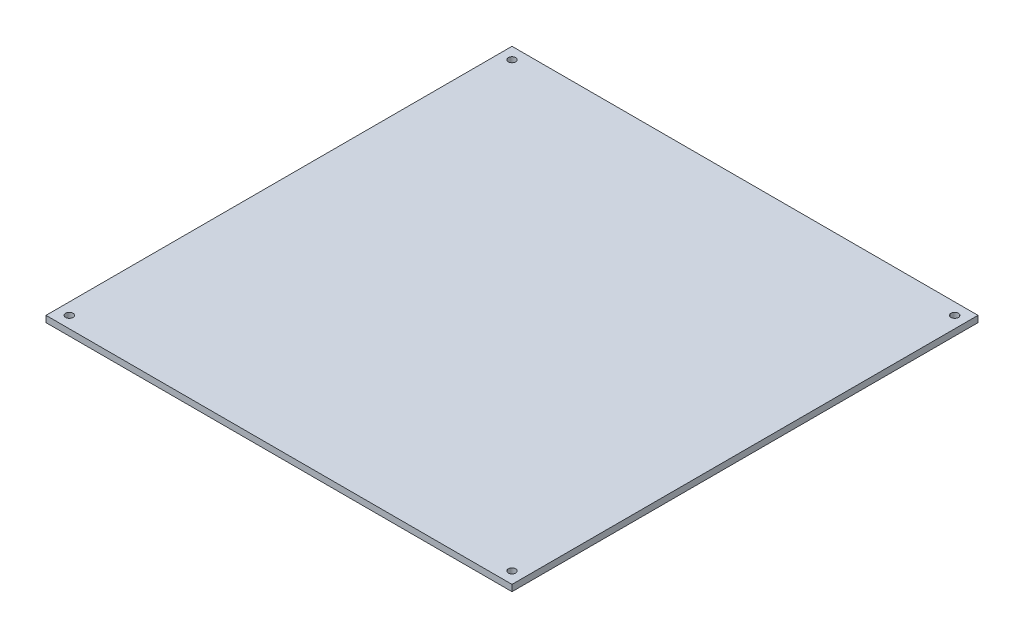
ISO-10303-21;
HEADER;
FILE_DESCRIPTION(('STEP AP214'),'2;1');
FILE_NAME('part.step','',(''),(''),'','','');
FILE_SCHEMA(('AUTOMOTIVE_DESIGN { 1 0 10303 214 1 1 1 1 }'));
ENDSEC;
DATA;
#1=APPLICATION_CONTEXT('core data for automotive mechanical design processes');
#2=APPLICATION_PROTOCOL_DEFINITION('international standard','automotive_design',2000,#1);
#3=PRODUCT_CONTEXT('',#1,'mechanical');
#4=PRODUCT('Part','Part','',(#3));
#5=PRODUCT_RELATED_PRODUCT_CATEGORY('part','',(#4));
#6=PRODUCT_DEFINITION_FORMATION('','',#4);
#7=PRODUCT_DEFINITION_CONTEXT('part definition',#1,'design');
#8=PRODUCT_DEFINITION('design','',#6,#7);
#9=PRODUCT_DEFINITION_SHAPE('','',#8);
#10=(LENGTH_UNIT() NAMED_UNIT(*) SI_UNIT(.MILLI.,.METRE.));
#11=(NAMED_UNIT(*) PLANE_ANGLE_UNIT() SI_UNIT($,.RADIAN.));
#12=(NAMED_UNIT(*) SI_UNIT($,.STERADIAN.) SOLID_ANGLE_UNIT());
#13=UNCERTAINTY_MEASURE_WITH_UNIT(LENGTH_MEASURE(1.E-05),#10,'distance_accuracy_value','');
#14=(GEOMETRIC_REPRESENTATION_CONTEXT(3) GLOBAL_UNCERTAINTY_ASSIGNED_CONTEXT((#13)) GLOBAL_UNIT_ASSIGNED_CONTEXT((#10,
#11,#12)) REPRESENTATION_CONTEXT('',''));
#15=CARTESIAN_POINT('',(0.,0.,0.));
#16=DIRECTION('',(0.,0.,1.));
#17=DIRECTION('',(1.,0.,0.));
#18=AXIS2_PLACEMENT_3D('',#15,#16,#17);
#19=CARTESIAN_POINT('',(0.,3.,0.));
#20=DIRECTION('',(0.,1.,0.));
#21=DIRECTION('',(0.,0.,1.));
#22=AXIS2_PLACEMENT_3D('',#19,#20,#21);
#23=PLANE('',#22);
#24=CARTESIAN_POINT('',(-5.50000000000001,3.,-5.5));
#25=DIRECTION('',(0.,1.,0.));
#26=DIRECTION('',(0.,0.,1.));
#27=AXIS2_PLACEMENT_3D('',#24,#25,#26);
#28=CIRCLE('',#27,1.75);
#29=CARTESIAN_POINT('',(-5.50000000000001,3.,-3.75));
#30=VERTEX_POINT('',#29);
#31=EDGE_CURVE('E142',#30,#30,#28,.T.);
#32=ORIENTED_EDGE('',*,*,#31,.F.);
#33=EDGE_LOOP('',(#32));
#34=FACE_BOUND('',#33,.T.);
#35=CARTESIAN_POINT('',(-214.5,3.,-214.5));
#36=DIRECTION('',(0.,1.,0.));
#37=DIRECTION('',(0.,0.,1.));
#38=AXIS2_PLACEMENT_3D('',#35,#36,#37);
#39=CIRCLE('',#38,1.75000000000001);
#40=CARTESIAN_POINT('',(-214.5,3.,-212.75));
#41=VERTEX_POINT('',#40);
#42=EDGE_CURVE('E112',#41,#41,#39,.T.);
#43=ORIENTED_EDGE('',*,*,#42,.F.);
#44=EDGE_LOOP('',(#43));
#45=FACE_BOUND('',#44,.T.);
#46=DIRECTION('',(0.,0.,-1.));
#47=VECTOR('',#46,1.);
#48=CARTESIAN_POINT('',(0.,3.,0.));
#49=LINE('',#48,#47);
#50=CARTESIAN_POINT('',(0.,3.,0.));
#51=VERTEX_POINT('',#50);
#52=CARTESIAN_POINT('',(0.,3.,-220.));
#53=VERTEX_POINT('',#52);
#54=EDGE_CURVE('E92',#51,#53,#49,.T.);
#55=ORIENTED_EDGE('',*,*,#54,.T.);
#56=DIRECTION('',(-1.,0.,0.));
#57=VECTOR('',#56,1.);
#58=CARTESIAN_POINT('',(0.,3.,-220.));
#59=LINE('',#58,#57);
#60=CARTESIAN_POINT('',(-220.,3.,-220.));
#61=VERTEX_POINT('',#60);
#62=EDGE_CURVE('E87',#53,#61,#59,.T.);
#63=ORIENTED_EDGE('',*,*,#62,.T.);
#64=DIRECTION('',(0.,0.,1.));
#65=VECTOR('',#64,1.);
#66=CARTESIAN_POINT('',(-220.,3.,0.));
#67=LINE('',#66,#65);
#68=CARTESIAN_POINT('',(-220.,3.,0.));
#69=VERTEX_POINT('',#68);
#70=EDGE_CURVE('E90',#61,#69,#67,.T.);
#71=ORIENTED_EDGE('',*,*,#70,.T.);
#72=DIRECTION('',(1.,0.,0.));
#73=VECTOR('',#72,1.);
#74=CARTESIAN_POINT('',(0.,3.,0.));
#75=LINE('',#74,#73);
#76=EDGE_CURVE('E57',#69,#51,#75,.T.);
#77=ORIENTED_EDGE('',*,*,#76,.T.);
#78=EDGE_LOOP('',(#55,#63,#71,#77));
#79=FACE_BOUND('',#78,.T.);
#80=CARTESIAN_POINT('',(-5.50000000000001,3.,-214.5));
#81=DIRECTION('',(0.,1.,0.));
#82=DIRECTION('',(0.,0.,-1.));
#83=AXIS2_PLACEMENT_3D('',#80,#81,#82);
#84=CIRCLE('',#83,1.75);
#85=CARTESIAN_POINT('',(-5.50000000000001,3.,-216.25));
#86=VERTEX_POINT('',#85);
#87=EDGE_CURVE('E134',#86,#86,#84,.T.);
#88=ORIENTED_EDGE('',*,*,#87,.F.);
#89=EDGE_LOOP('',(#88));
#90=FACE_BOUND('',#89,.T.);
#91=CARTESIAN_POINT('',(-214.5,3.,-5.50000000000003));
#92=DIRECTION('',(0.,1.,0.));
#93=DIRECTION('',(0.,0.,-1.));
#94=AXIS2_PLACEMENT_3D('',#91,#92,#93);
#95=CIRCLE('',#94,1.75000000000001);
#96=CARTESIAN_POINT('',(-214.5,3.,-7.25000000000004));
#97=VERTEX_POINT('',#96);
#98=EDGE_CURVE('E150',#97,#97,#95,.T.);
#99=ORIENTED_EDGE('',*,*,#98,.F.);
#100=EDGE_LOOP('',(#99));
#101=FACE_BOUND('',#100,.T.);
#102=ADVANCED_FACE('F39',(#34,#45,#79,#90,#101),#23,.T.);
#103=CARTESIAN_POINT('',(0.,0.,0.));
#104=DIRECTION('',(0.,1.,0.));
#105=DIRECTION('',(0.,0.,1.));
#106=AXIS2_PLACEMENT_3D('',#103,#104,#105);
#107=PLANE('',#106);
#108=DIRECTION('',(0.,0.,-1.));
#109=VECTOR('',#108,1.);
#110=CARTESIAN_POINT('',(0.,0.,0.));
#111=LINE('',#110,#109);
#112=CARTESIAN_POINT('',(0.,0.,0.));
#113=VERTEX_POINT('',#112);
#114=CARTESIAN_POINT('',(0.,0.,-220.));
#115=VERTEX_POINT('',#114);
#116=EDGE_CURVE('E108',#113,#115,#111,.T.);
#117=ORIENTED_EDGE('',*,*,#116,.F.);
#118=DIRECTION('',(1.,0.,0.));
#119=VECTOR('',#118,1.);
#120=CARTESIAN_POINT('',(0.,0.,0.));
#121=LINE('',#120,#119);
#122=CARTESIAN_POINT('',(-220.,0.,0.));
#123=VERTEX_POINT('',#122);
#124=EDGE_CURVE('E80',#123,#113,#121,.T.);
#125=ORIENTED_EDGE('',*,*,#124,.F.);
#126=DIRECTION('',(0.,0.,1.));
#127=VECTOR('',#126,1.);
#128=CARTESIAN_POINT('',(-220.,0.,0.));
#129=LINE('',#128,#127);
#130=CARTESIAN_POINT('',(-220.,0.,-220.));
#131=VERTEX_POINT('',#130);
#132=EDGE_CURVE('E74',#131,#123,#129,.T.);
#133=ORIENTED_EDGE('',*,*,#132,.F.);
#134=DIRECTION('',(-1.,0.,0.));
#135=VECTOR('',#134,1.);
#136=CARTESIAN_POINT('',(0.,0.,-220.));
#137=LINE('',#136,#135);
#138=EDGE_CURVE('E97',#115,#131,#137,.T.);
#139=ORIENTED_EDGE('',*,*,#138,.F.);
#140=EDGE_LOOP('',(#117,#125,#133,#139));
#141=FACE_BOUND('',#140,.T.);
#142=CARTESIAN_POINT('',(-214.5,0.,-214.5));
#143=DIRECTION('',(0.,1.,0.));
#144=DIRECTION('',(0.,0.,1.));
#145=AXIS2_PLACEMENT_3D('',#142,#143,#144);
#146=CIRCLE('',#145,1.75000000000001);
#147=CARTESIAN_POINT('',(-214.5,0.,-212.75));
#148=VERTEX_POINT('',#147);
#149=EDGE_CURVE('E130',#148,#148,#146,.T.);
#150=ORIENTED_EDGE('',*,*,#149,.T.);
#151=EDGE_LOOP('',(#150));
#152=FACE_BOUND('',#151,.T.);
#153=CARTESIAN_POINT('',(-5.50000000000001,0.,-214.5));
#154=DIRECTION('',(0.,1.,0.));
#155=DIRECTION('',(0.,0.,-1.));
#156=AXIS2_PLACEMENT_3D('',#153,#154,#155);
#157=CIRCLE('',#156,1.75);
#158=CARTESIAN_POINT('',(-5.50000000000001,0.,-216.25));
#159=VERTEX_POINT('',#158);
#160=EDGE_CURVE('E138',#159,#159,#157,.T.);
#161=ORIENTED_EDGE('',*,*,#160,.T.);
#162=EDGE_LOOP('',(#161));
#163=FACE_BOUND('',#162,.T.);
#164=CARTESIAN_POINT('',(-5.50000000000001,0.,-5.5));
#165=DIRECTION('',(0.,1.,0.));
#166=DIRECTION('',(0.,0.,1.));
#167=AXIS2_PLACEMENT_3D('',#164,#165,#166);
#168=CIRCLE('',#167,1.75);
#169=CARTESIAN_POINT('',(-5.50000000000001,0.,-3.75));
#170=VERTEX_POINT('',#169);
#171=EDGE_CURVE('E146',#170,#170,#168,.T.);
#172=ORIENTED_EDGE('',*,*,#171,.T.);
#173=EDGE_LOOP('',(#172));
#174=FACE_BOUND('',#173,.T.);
#175=CARTESIAN_POINT('',(-214.5,0.,-5.50000000000003));
#176=DIRECTION('',(0.,1.,0.));
#177=DIRECTION('',(0.,0.,-1.));
#178=AXIS2_PLACEMENT_3D('',#175,#176,#177);
#179=CIRCLE('',#178,1.75000000000001);
#180=CARTESIAN_POINT('',(-214.5,0.,-7.25000000000004));
#181=VERTEX_POINT('',#180);
#182=EDGE_CURVE('E154',#181,#181,#179,.T.);
#183=ORIENTED_EDGE('',*,*,#182,.T.);
#184=EDGE_LOOP('',(#183));
#185=FACE_BOUND('',#184,.T.);
#186=ADVANCED_FACE('F125',(#141,#152,#163,#174,#185),#107,.F.);
#187=CARTESIAN_POINT('',(0.,3.,0.));
#188=DIRECTION('',(-1.,0.,0.));
#189=DIRECTION('',(0.,0.,1.));
#190=AXIS2_PLACEMENT_3D('',#187,#188,#189);
#191=PLANE('',#190);
#192=ORIENTED_EDGE('',*,*,#116,.T.);
#193=DIRECTION('',(0.,-1.,0.));
#194=VECTOR('',#193,1.);
#195=CARTESIAN_POINT('',(0.,3.,-220.));
#196=LINE('',#195,#194);
#197=EDGE_CURVE('E11',#53,#115,#196,.T.);
#198=ORIENTED_EDGE('',*,*,#197,.F.);
#199=ORIENTED_EDGE('',*,*,#54,.F.);
#200=DIRECTION('',(0.,-1.,0.));
#201=VECTOR('',#200,1.);
#202=CARTESIAN_POINT('',(0.,3.,0.));
#203=LINE('',#202,#201);
#204=EDGE_CURVE('E104',#51,#113,#203,.T.);
#205=ORIENTED_EDGE('',*,*,#204,.T.);
#206=EDGE_LOOP('',(#192,#198,#199,#205));
#207=FACE_BOUND('',#206,.T.);
#208=ADVANCED_FACE('F41',(#207),#191,.F.);
#209=CARTESIAN_POINT('',(0.,3.,-220.));
#210=DIRECTION('',(0.,0.,1.));
#211=DIRECTION('',(1.,0.,0.));
#212=AXIS2_PLACEMENT_3D('',#209,#210,#211);
#213=PLANE('',#212);
#214=ORIENTED_EDGE('',*,*,#138,.T.);
#215=DIRECTION('',(0.,-1.,0.));
#216=VECTOR('',#215,1.);
#217=CARTESIAN_POINT('',(-220.,3.,-220.));
#218=LINE('',#217,#216);
#219=EDGE_CURVE('E49',#61,#131,#218,.T.);
#220=ORIENTED_EDGE('',*,*,#219,.F.);
#221=ORIENTED_EDGE('',*,*,#62,.F.);
#222=ORIENTED_EDGE('',*,*,#197,.T.);
#223=EDGE_LOOP('',(#214,#220,#221,#222));
#224=FACE_BOUND('',#223,.T.);
#225=ADVANCED_FACE('F96',(#224),#213,.F.);
#226=CARTESIAN_POINT('',(-220.,3.,0.));
#227=DIRECTION('',(1.,0.,0.));
#228=DIRECTION('',(0.,0.,-1.));
#229=AXIS2_PLACEMENT_3D('',#226,#227,#228);
#230=PLANE('',#229);
#231=ORIENTED_EDGE('',*,*,#132,.T.);
#232=DIRECTION('',(0.,-1.,0.));
#233=VECTOR('',#232,1.);
#234=CARTESIAN_POINT('',(-220.,3.,0.));
#235=LINE('',#234,#233);
#236=EDGE_CURVE('E99',#69,#123,#235,.T.);
#237=ORIENTED_EDGE('',*,*,#236,.F.);
#238=ORIENTED_EDGE('',*,*,#70,.F.);
#239=ORIENTED_EDGE('',*,*,#219,.T.);
#240=EDGE_LOOP('',(#231,#237,#238,#239));
#241=FACE_BOUND('',#240,.T.);
#242=ADVANCED_FACE('F100',(#241),#230,.F.);
#243=CARTESIAN_POINT('',(0.,3.,0.));
#244=DIRECTION('',(0.,0.,-1.));
#245=DIRECTION('',(-1.,0.,0.));
#246=AXIS2_PLACEMENT_3D('',#243,#244,#245);
#247=PLANE('',#246);
#248=ORIENTED_EDGE('',*,*,#124,.T.);
#249=ORIENTED_EDGE('',*,*,#204,.F.);
#250=ORIENTED_EDGE('',*,*,#76,.F.);
#251=ORIENTED_EDGE('',*,*,#236,.T.);
#252=EDGE_LOOP('',(#248,#249,#250,#251));
#253=FACE_BOUND('',#252,.T.);
#254=ADVANCED_FACE('F122',(#253),#247,.F.);
#255=CARTESIAN_POINT('',(-214.5,3.,-214.5));
#256=DIRECTION('',(0.,-1.,0.));
#257=DIRECTION('',(0.,0.,-1.));
#258=AXIS2_PLACEMENT_3D('',#255,#256,#257);
#259=CYLINDRICAL_SURFACE('',#258,1.75000000000001);
#260=ORIENTED_EDGE('',*,*,#42,.T.);
#261=EDGE_LOOP('',(#260));
#262=FACE_BOUND('',#261,.T.);
#263=ORIENTED_EDGE('',*,*,#149,.F.);
#264=EDGE_LOOP('',(#263));
#265=FACE_BOUND('',#264,.T.);
#266=ADVANCED_FACE('F175',(#262,#265),#259,.F.);
#267=CARTESIAN_POINT('',(-5.50000000000001,3.,-214.5));
#268=DIRECTION('',(0.,-1.,0.));
#269=DIRECTION('',(0.,0.,-1.));
#270=AXIS2_PLACEMENT_3D('',#267,#268,#269);
#271=CYLINDRICAL_SURFACE('',#270,1.75);
#272=ORIENTED_EDGE('',*,*,#87,.T.);
#273=EDGE_LOOP('',(#272));
#274=FACE_BOUND('',#273,.T.);
#275=ORIENTED_EDGE('',*,*,#160,.F.);
#276=EDGE_LOOP('',(#275));
#277=FACE_BOUND('',#276,.T.);
#278=ADVANCED_FACE('F221',(#274,#277),#271,.F.);
#279=CARTESIAN_POINT('',(-5.50000000000001,3.,-5.5));
#280=DIRECTION('',(0.,-1.,0.));
#281=DIRECTION('',(0.,0.,-1.));
#282=AXIS2_PLACEMENT_3D('',#279,#280,#281);
#283=CYLINDRICAL_SURFACE('',#282,1.75);
#284=ORIENTED_EDGE('',*,*,#31,.T.);
#285=EDGE_LOOP('',(#284));
#286=FACE_BOUND('',#285,.T.);
#287=ORIENTED_EDGE('',*,*,#171,.F.);
#288=EDGE_LOOP('',(#287));
#289=FACE_BOUND('',#288,.T.);
#290=ADVANCED_FACE('F229',(#286,#289),#283,.F.);
#291=CARTESIAN_POINT('',(-214.5,3.,-5.50000000000003));
#292=DIRECTION('',(0.,-1.,0.));
#293=DIRECTION('',(0.,0.,-1.));
#294=AXIS2_PLACEMENT_3D('',#291,#292,#293);
#295=CYLINDRICAL_SURFACE('',#294,1.75000000000001);
#296=ORIENTED_EDGE('',*,*,#98,.T.);
#297=EDGE_LOOP('',(#296));
#298=FACE_BOUND('',#297,.T.);
#299=ORIENTED_EDGE('',*,*,#182,.F.);
#300=EDGE_LOOP('',(#299));
#301=FACE_BOUND('',#300,.T.);
#302=ADVANCED_FACE('F162',(#298,#301),#295,.F.);
#303=CLOSED_SHELL('',(#102,#186,#208,#225,#242,#254,#266,#278,#290,#302));
#304=MANIFOLD_SOLID_BREP('B2',#303);
#305=ADVANCED_BREP_SHAPE_REPRESENTATION('',(#18,#304),#14);
#306=SHAPE_DEFINITION_REPRESENTATION(#9,#305);
ENDSEC;
END-ISO-10303-21;
